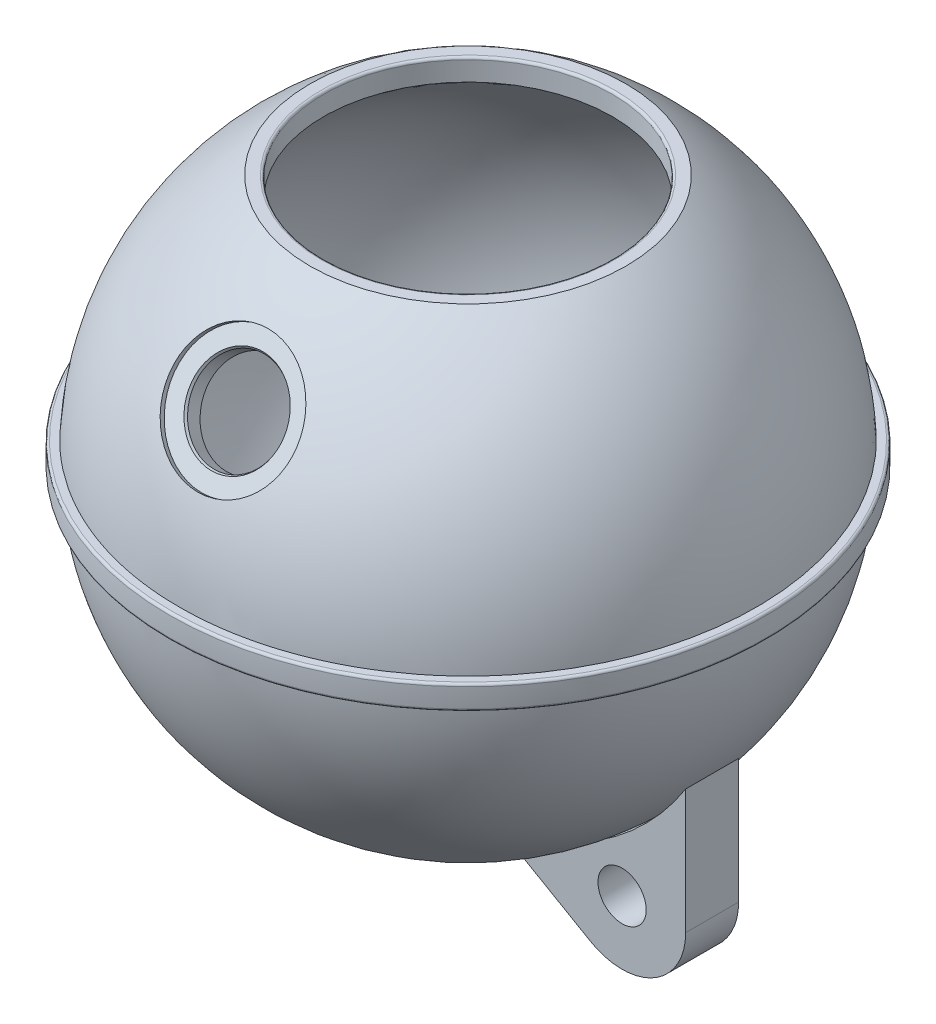
ISO-10303-21;
HEADER;
FILE_DESCRIPTION(('STEP AP214'),'2;1');
FILE_NAME('part.step','',(''),(''),'','','');
FILE_SCHEMA(('AUTOMOTIVE_DESIGN { 1 0 10303 214 1 1 1 1 }'));
ENDSEC;
DATA;
#1=APPLICATION_CONTEXT('core data for automotive mechanical design processes');
#2=APPLICATION_PROTOCOL_DEFINITION('international standard','automotive_design',2000,#1);
#3=PRODUCT_CONTEXT('',#1,'mechanical');
#4=PRODUCT('Part','Part','',(#3));
#5=PRODUCT_RELATED_PRODUCT_CATEGORY('part','',(#4));
#6=PRODUCT_DEFINITION_FORMATION('','',#4);
#7=PRODUCT_DEFINITION_CONTEXT('part definition',#1,'design');
#8=PRODUCT_DEFINITION('design','',#6,#7);
#9=PRODUCT_DEFINITION_SHAPE('','',#8);
#10=(LENGTH_UNIT() NAMED_UNIT(*) SI_UNIT(.MILLI.,.METRE.));
#11=(NAMED_UNIT(*) PLANE_ANGLE_UNIT() SI_UNIT($,.RADIAN.));
#12=(NAMED_UNIT(*) SI_UNIT($,.STERADIAN.) SOLID_ANGLE_UNIT());
#13=UNCERTAINTY_MEASURE_WITH_UNIT(LENGTH_MEASURE(1.E-05),#10,'distance_accuracy_value','');
#14=(GEOMETRIC_REPRESENTATION_CONTEXT(3) GLOBAL_UNCERTAINTY_ASSIGNED_CONTEXT((#13)) GLOBAL_UNIT_ASSIGNED_CONTEXT((#10,
#11,#12)) REPRESENTATION_CONTEXT('',''));
#15=CARTESIAN_POINT('',(0.,0.,0.));
#16=DIRECTION('',(0.,0.,1.));
#17=DIRECTION('',(1.,0.,0.));
#18=AXIS2_PLACEMENT_3D('',#15,#16,#17);
#19=CARTESIAN_POINT('',(95.2500000000001,-147.117317471466,-13.97));
#20=DIRECTION('',(0.,0.,1.));
#21=DIRECTION('',(1.,0.,0.));
#22=AXIS2_PLACEMENT_3D('',#19,#20,#21);
#23=CYLINDRICAL_SURFACE('',#22,33.528);
#24=DIRECTION('',(0.,0.,1.));
#25=VECTOR('',#24,1.);
#26=CARTESIAN_POINT('',(128.778,-147.117317471466,-13.97));
#27=LINE('',#26,#25);
#28=CARTESIAN_POINT('',(128.778,-147.117317471466,-13.97));
#29=VERTEX_POINT('',#28);
#30=CARTESIAN_POINT('',(128.778,-147.117317471466,13.97));
#31=VERTEX_POINT('',#30);
#32=EDGE_CURVE('E63',#29,#31,#27,.T.);
#33=ORIENTED_EDGE('',*,*,#32,.T.);
#34=CARTESIAN_POINT('',(95.2500000000001,-147.117317471466,13.97));
#35=DIRECTION('',(0.,0.,1.));
#36=DIRECTION('',(-1.,0.,0.));
#37=AXIS2_PLACEMENT_3D('',#34,#35,#36);
#38=CIRCLE('',#37,33.528);
#39=CARTESIAN_POINT('',(78.4859999999999,-176.15341720955,13.97));
#40=VERTEX_POINT('',#39);
#41=EDGE_CURVE('E100',#40,#31,#38,.T.);
#42=ORIENTED_EDGE('',*,*,#41,.F.);
#43=DIRECTION('',(0.,0.,1.));
#44=VECTOR('',#43,1.);
#45=CARTESIAN_POINT('',(78.4859999999999,-176.15341720955,-13.97));
#46=LINE('',#45,#44);
#47=CARTESIAN_POINT('',(78.4859999999999,-176.15341720955,-13.97));
#48=VERTEX_POINT('',#47);
#49=EDGE_CURVE('E13',#48,#40,#46,.T.);
#50=ORIENTED_EDGE('',*,*,#49,.F.);
#51=CARTESIAN_POINT('',(95.2500000000001,-147.117317471466,-13.97));
#52=DIRECTION('',(0.,0.,1.));
#53=DIRECTION('',(-1.,0.,0.));
#54=AXIS2_PLACEMENT_3D('',#51,#52,#53);
#55=CIRCLE('',#54,33.528);
#56=EDGE_CURVE('E101',#48,#29,#55,.T.);
#57=ORIENTED_EDGE('',*,*,#56,.T.);
#58=EDGE_LOOP('',(#33,#42,#50,#57));
#59=FACE_BOUND('',#58,.T.);
#60=ADVANCED_FACE('F60',(#59),#23,.T.);
#61=CARTESIAN_POINT('',(78.4859999999999,-176.15341720955,-13.97));
#62=DIRECTION('',(-0.500000000000004,-0.866025403784436,0.));
#63=DIRECTION('',(0.866025403784436,-0.500000000000004,0.));
#64=AXIS2_PLACEMENT_3D('',#61,#62,#63);
#65=PLANE('',#64);
#66=ORIENTED_EDGE('',*,*,#49,.T.);
#67=DIRECTION('',(0.866025403784436,-0.500000000000004,0.));
#68=VECTOR('',#67,1.);
#69=CARTESIAN_POINT('',(78.4859999999999,-176.15341720955,13.97));
#70=LINE('',#69,#68);
#71=CARTESIAN_POINT('',(31.6052209873836,-149.086786826796,13.97));
#72=VERTEX_POINT('',#71);
#73=EDGE_CURVE('E118',#72,#40,#70,.T.);
#74=ORIENTED_EDGE('',*,*,#73,.F.);
#75=DIRECTION('',(0.,0.,1.));
#76=VECTOR('',#75,1.);
#77=CARTESIAN_POINT('',(31.6052209873836,-149.086786826796,-13.97));
#78=LINE('',#77,#76);
#79=CARTESIAN_POINT('',(31.6052209873836,-149.086786826796,-13.97));
#80=VERTEX_POINT('',#79);
#81=EDGE_CURVE('E68',#80,#72,#78,.T.);
#82=ORIENTED_EDGE('',*,*,#81,.F.);
#83=DIRECTION('',(0.866025403784436,-0.500000000000004,0.));
#84=VECTOR('',#83,1.);
#85=CARTESIAN_POINT('',(78.4859999999999,-176.15341720955,-13.97));
#86=LINE('',#85,#84);
#87=EDGE_CURVE('E106',#80,#48,#86,.T.);
#88=ORIENTED_EDGE('',*,*,#87,.T.);
#89=EDGE_LOOP('',(#66,#74,#82,#88));
#90=FACE_BOUND('',#89,.T.);
#91=ADVANCED_FACE('F139',(#90),#65,.T.);
#92=CARTESIAN_POINT('',(0.,0.,-13.97));
#93=DIRECTION('',(0.,0.,1.));
#94=DIRECTION('',(1.,0.,0.));
#95=AXIS2_PLACEMENT_3D('',#92,#93,#94);
#96=CYLINDRICAL_SURFACE('',#95,152.4);
#97=ORIENTED_EDGE('',*,*,#81,.T.);
#98=CARTESIAN_POINT('',(0.,0.,13.97));
#99=DIRECTION('',(0.,0.,-1.));
#100=DIRECTION('',(1.,0.,0.));
#101=AXIS2_PLACEMENT_3D('',#98,#99,#100);
#102=CIRCLE('',#101,152.4);
#103=CARTESIAN_POINT('',(128.778,-81.4983847447298,13.97));
#104=VERTEX_POINT('',#103);
#105=EDGE_CURVE('E113',#104,#72,#102,.T.);
#106=ORIENTED_EDGE('',*,*,#105,.F.);
#107=DIRECTION('',(0.,0.,1.));
#108=VECTOR('',#107,1.);
#109=CARTESIAN_POINT('',(128.778,-81.4983847447298,-13.97));
#110=LINE('',#109,#108);
#111=CARTESIAN_POINT('',(128.778,-81.4983847447298,-13.97));
#112=VERTEX_POINT('',#111);
#113=EDGE_CURVE('E105',#112,#104,#110,.T.);
#114=ORIENTED_EDGE('',*,*,#113,.F.);
#115=CARTESIAN_POINT('',(0.,0.,-13.97));
#116=DIRECTION('',(0.,0.,-1.));
#117=DIRECTION('',(1.,0.,0.));
#118=AXIS2_PLACEMENT_3D('',#115,#116,#117);
#119=CIRCLE('',#118,152.4);
#120=EDGE_CURVE('E132',#112,#80,#119,.T.);
#121=ORIENTED_EDGE('',*,*,#120,.T.);
#122=EDGE_LOOP('',(#97,#106,#114,#121));
#123=FACE_BOUND('',#122,.T.);
#124=ADVANCED_FACE('F136',(#123),#96,.F.);
#125=CARTESIAN_POINT('',(128.778,-81.4983847447298,-13.97));
#126=DIRECTION('',(1.,0.,0.));
#127=DIRECTION('',(0.,0.,-1.));
#128=AXIS2_PLACEMENT_3D('',#125,#126,#127);
#129=PLANE('',#128);
#130=ORIENTED_EDGE('',*,*,#113,.T.);
#131=DIRECTION('',(0.,1.,0.));
#132=VECTOR('',#131,1.);
#133=CARTESIAN_POINT('',(128.778,-81.4983847447298,13.97));
#134=LINE('',#133,#132);
#135=EDGE_CURVE('E108',#31,#104,#134,.T.);
#136=ORIENTED_EDGE('',*,*,#135,.F.);
#137=ORIENTED_EDGE('',*,*,#32,.F.);
#138=DIRECTION('',(0.,1.,0.));
#139=VECTOR('',#138,1.);
#140=CARTESIAN_POINT('',(128.778,-81.4983847447298,-13.97));
#141=LINE('',#140,#139);
#142=EDGE_CURVE('E130',#29,#112,#141,.T.);
#143=ORIENTED_EDGE('',*,*,#142,.T.);
#144=EDGE_LOOP('',(#130,#136,#137,#143));
#145=FACE_BOUND('',#144,.T.);
#146=ADVANCED_FACE('F109',(#145),#129,.T.);
#147=CARTESIAN_POINT('',(95.2500000000001,-147.117317471466,-13.97));
#148=DIRECTION('',(0.,0.,-1.));
#149=DIRECTION('',(-1.,0.,0.));
#150=AXIS2_PLACEMENT_3D('',#147,#148,#149);
#151=PLANE('',#150);
#152=CARTESIAN_POINT('',(95.2500000000001,-147.117317471466,-13.97));
#153=DIRECTION('',(0.,0.,1.));
#154=DIRECTION('',(-1.,0.,0.));
#155=AXIS2_PLACEMENT_3D('',#152,#153,#154);
#156=CIRCLE('',#155,12.7);
#157=CARTESIAN_POINT('',(82.5500000000001,-147.117317471466,-13.97));
#158=VERTEX_POINT('',#157);
#159=EDGE_CURVE('E126',#158,#158,#156,.T.);
#160=ORIENTED_EDGE('',*,*,#159,.T.);
#161=EDGE_LOOP('',(#160));
#162=FACE_BOUND('',#161,.T.);
#163=ORIENTED_EDGE('',*,*,#56,.F.);
#164=ORIENTED_EDGE('',*,*,#87,.F.);
#165=ORIENTED_EDGE('',*,*,#120,.F.);
#166=ORIENTED_EDGE('',*,*,#142,.F.);
#167=EDGE_LOOP('',(#163,#164,#165,#166));
#168=FACE_BOUND('',#167,.T.);
#169=ADVANCED_FACE('F141',(#162,#168),#151,.T.);
#170=CARTESIAN_POINT('',(95.2500000000001,-147.117317471466,-13.97));
#171=DIRECTION('',(0.,0.,1.));
#172=DIRECTION('',(1.,0.,0.));
#173=AXIS2_PLACEMENT_3D('',#170,#171,#172);
#174=CYLINDRICAL_SURFACE('',#173,12.7);
#175=ORIENTED_EDGE('',*,*,#159,.F.);
#176=EDGE_LOOP('',(#175));
#177=FACE_BOUND('',#176,.T.);
#178=CARTESIAN_POINT('',(95.2500000000001,-147.117317471466,13.97));
#179=DIRECTION('',(0.,0.,1.));
#180=DIRECTION('',(-1.,0.,0.));
#181=AXIS2_PLACEMENT_3D('',#178,#179,#180);
#182=CIRCLE('',#181,12.7);
#183=CARTESIAN_POINT('',(82.5500000000001,-147.117317471466,13.97));
#184=VERTEX_POINT('',#183);
#185=EDGE_CURVE('E119',#184,#184,#182,.T.);
#186=ORIENTED_EDGE('',*,*,#185,.T.);
#187=EDGE_LOOP('',(#186));
#188=FACE_BOUND('',#187,.T.);
#189=ADVANCED_FACE('F143',(#177,#188),#174,.F.);
#190=CARTESIAN_POINT('',(95.2500000000001,-147.117317471466,13.97));
#191=DIRECTION('',(0.,0.,-1.));
#192=DIRECTION('',(-1.,0.,0.));
#193=AXIS2_PLACEMENT_3D('',#190,#191,#192);
#194=PLANE('',#193);
#195=ORIENTED_EDGE('',*,*,#41,.T.);
#196=ORIENTED_EDGE('',*,*,#135,.T.);
#197=ORIENTED_EDGE('',*,*,#105,.T.);
#198=ORIENTED_EDGE('',*,*,#73,.T.);
#199=EDGE_LOOP('',(#195,#196,#197,#198));
#200=FACE_BOUND('',#199,.T.);
#201=ORIENTED_EDGE('',*,*,#185,.F.);
#202=EDGE_LOOP('',(#201));
#203=FACE_BOUND('',#202,.T.);
#204=ADVANCED_FACE('F116',(#200,#203),#194,.F.);
#205=CLOSED_SHELL('',(#60,#91,#124,#146,#169,#189,#204));
#206=MANIFOLD_SOLID_BREP('B2',#205);
#207=CARTESIAN_POINT('',(0.,0.,-13.97));
#208=DIRECTION('',(0.,0.,1.));
#209=DIRECTION('',(1.,0.,0.));
#210=AXIS2_PLACEMENT_3D('',#207,#208,#209);
#211=CYLINDRICAL_SURFACE('',#210,152.4);
#212=DIRECTION('',(0.,0.,1.));
#213=VECTOR('',#212,1.);
#214=CARTESIAN_POINT('',(-128.778,-81.4983847447298,-13.97));
#215=LINE('',#214,#213);
#216=CARTESIAN_POINT('',(-128.778,-81.4983847447298,-13.97));
#217=VERTEX_POINT('',#216);
#218=CARTESIAN_POINT('',(-128.778,-81.4983847447298,13.97));
#219=VERTEX_POINT('',#218);
#220=EDGE_CURVE('E215',#217,#219,#215,.T.);
#221=ORIENTED_EDGE('',*,*,#220,.T.);
#222=CARTESIAN_POINT('',(0.,0.,13.97));
#223=DIRECTION('',(0.,0.,-1.));
#224=DIRECTION('',(-1.,0.,0.));
#225=AXIS2_PLACEMENT_3D('',#222,#223,#224);
#226=CIRCLE('',#225,152.4);
#227=CARTESIAN_POINT('',(-31.6052209873834,-149.086786826797,13.97));
#228=VERTEX_POINT('',#227);
#229=EDGE_CURVE('E252',#228,#219,#226,.T.);
#230=ORIENTED_EDGE('',*,*,#229,.F.);
#231=DIRECTION('',(0.,0.,1.));
#232=VECTOR('',#231,1.);
#233=CARTESIAN_POINT('',(-31.6052209873834,-149.086786826797,-13.97));
#234=LINE('',#233,#232);
#235=CARTESIAN_POINT('',(-31.6052209873834,-149.086786826797,-13.97));
#236=VERTEX_POINT('',#235);
#237=EDGE_CURVE('E58',#236,#228,#234,.T.);
#238=ORIENTED_EDGE('',*,*,#237,.F.);
#239=CARTESIAN_POINT('',(0.,0.,-13.97));
#240=DIRECTION('',(0.,0.,-1.));
#241=DIRECTION('',(-1.,0.,0.));
#242=AXIS2_PLACEMENT_3D('',#239,#240,#241);
#243=CIRCLE('',#242,152.4);
#244=EDGE_CURVE('E253',#236,#217,#243,.T.);
#245=ORIENTED_EDGE('',*,*,#244,.T.);
#246=EDGE_LOOP('',(#221,#230,#238,#245));
#247=FACE_BOUND('',#246,.T.);
#248=ADVANCED_FACE('F212',(#247),#211,.F.);
#249=CARTESIAN_POINT('',(-78.4859999999998,-176.15341720955,-13.97));
#250=DIRECTION('',(0.500000000000003,-0.866025403784437,0.));
#251=DIRECTION('',(0.866025403784437,0.500000000000003,0.));
#252=AXIS2_PLACEMENT_3D('',#249,#250,#251);
#253=PLANE('',#252);
#254=ORIENTED_EDGE('',*,*,#237,.T.);
#255=DIRECTION('',(0.866025403784437,0.500000000000003,0.));
#256=VECTOR('',#255,1.);
#257=CARTESIAN_POINT('',(-78.4859999999998,-176.15341720955,13.97));
#258=LINE('',#257,#256);
#259=CARTESIAN_POINT('',(-78.4859999999998,-176.15341720955,13.97));
#260=VERTEX_POINT('',#259);
#261=EDGE_CURVE('E270',#260,#228,#258,.T.);
#262=ORIENTED_EDGE('',*,*,#261,.F.);
#263=DIRECTION('',(0.,0.,1.));
#264=VECTOR('',#263,1.);
#265=CARTESIAN_POINT('',(-78.4859999999998,-176.15341720955,-13.97));
#266=LINE('',#265,#264);
#267=CARTESIAN_POINT('',(-78.4859999999998,-176.15341720955,-13.97));
#268=VERTEX_POINT('',#267);
#269=EDGE_CURVE('E220',#268,#260,#266,.T.);
#270=ORIENTED_EDGE('',*,*,#269,.F.);
#271=DIRECTION('',(0.866025403784437,0.500000000000003,0.));
#272=VECTOR('',#271,1.);
#273=CARTESIAN_POINT('',(-78.4859999999998,-176.15341720955,-13.97));
#274=LINE('',#273,#272);
#275=EDGE_CURVE('E258',#268,#236,#274,.T.);
#276=ORIENTED_EDGE('',*,*,#275,.T.);
#277=EDGE_LOOP('',(#254,#262,#270,#276));
#278=FACE_BOUND('',#277,.T.);
#279=ADVANCED_FACE('F291',(#278),#253,.T.);
#280=CARTESIAN_POINT('',(-95.25,-147.117317471466,-13.97));
#281=DIRECTION('',(0.,0.,1.));
#282=DIRECTION('',(1.,0.,0.));
#283=AXIS2_PLACEMENT_3D('',#280,#281,#282);
#284=CYLINDRICAL_SURFACE('',#283,33.528);
#285=ORIENTED_EDGE('',*,*,#269,.T.);
#286=CARTESIAN_POINT('',(-95.25,-147.117317471466,13.97));
#287=DIRECTION('',(0.,0.,1.));
#288=DIRECTION('',(1.,0.,0.));
#289=AXIS2_PLACEMENT_3D('',#286,#287,#288);
#290=CIRCLE('',#289,33.528);
#291=CARTESIAN_POINT('',(-128.778,-147.117317471466,13.97));
#292=VERTEX_POINT('',#291);
#293=EDGE_CURVE('E265',#292,#260,#290,.T.);
#294=ORIENTED_EDGE('',*,*,#293,.F.);
#295=DIRECTION('',(0.,0.,1.));
#296=VECTOR('',#295,1.);
#297=CARTESIAN_POINT('',(-128.778,-147.117317471466,-13.97));
#298=LINE('',#297,#296);
#299=CARTESIAN_POINT('',(-128.778,-147.117317471466,-13.97));
#300=VERTEX_POINT('',#299);
#301=EDGE_CURVE('E257',#300,#292,#298,.T.);
#302=ORIENTED_EDGE('',*,*,#301,.F.);
#303=CARTESIAN_POINT('',(-95.25,-147.117317471466,-13.97));
#304=DIRECTION('',(0.,0.,1.));
#305=DIRECTION('',(1.,0.,0.));
#306=AXIS2_PLACEMENT_3D('',#303,#304,#305);
#307=CIRCLE('',#306,33.528);
#308=EDGE_CURVE('E284',#300,#268,#307,.T.);
#309=ORIENTED_EDGE('',*,*,#308,.T.);
#310=EDGE_LOOP('',(#285,#294,#302,#309));
#311=FACE_BOUND('',#310,.T.);
#312=ADVANCED_FACE('F288',(#311),#284,.T.);
#313=CARTESIAN_POINT('',(-128.778,-81.4983847447298,-13.97));
#314=DIRECTION('',(-1.,0.,0.));
#315=DIRECTION('',(0.,0.,1.));
#316=AXIS2_PLACEMENT_3D('',#313,#314,#315);
#317=PLANE('',#316);
#318=ORIENTED_EDGE('',*,*,#301,.T.);
#319=DIRECTION('',(0.,-1.,0.));
#320=VECTOR('',#319,1.);
#321=CARTESIAN_POINT('',(-128.778,-81.4983847447298,13.97));
#322=LINE('',#321,#320);
#323=EDGE_CURVE('E260',#219,#292,#322,.T.);
#324=ORIENTED_EDGE('',*,*,#323,.F.);
#325=ORIENTED_EDGE('',*,*,#220,.F.);
#326=DIRECTION('',(0.,-1.,0.));
#327=VECTOR('',#326,1.);
#328=CARTESIAN_POINT('',(-128.778,-81.4983847447298,-13.97));
#329=LINE('',#328,#327);
#330=EDGE_CURVE('E282',#217,#300,#329,.T.);
#331=ORIENTED_EDGE('',*,*,#330,.T.);
#332=EDGE_LOOP('',(#318,#324,#325,#331));
#333=FACE_BOUND('',#332,.T.);
#334=ADVANCED_FACE('F261',(#333),#317,.T.);
#335=CARTESIAN_POINT('',(0.,0.,-13.97));
#336=DIRECTION('',(0.,0.,-1.));
#337=DIRECTION('',(-1.,0.,0.));
#338=AXIS2_PLACEMENT_3D('',#335,#336,#337);
#339=PLANE('',#338);
#340=CARTESIAN_POINT('',(-95.25,-147.117317471466,-13.97));
#341=DIRECTION('',(0.,0.,1.));
#342=DIRECTION('',(1.,0.,0.));
#343=AXIS2_PLACEMENT_3D('',#340,#341,#342);
#344=CIRCLE('',#343,12.7);
#345=CARTESIAN_POINT('',(-82.55,-147.117317471466,-13.97));
#346=VERTEX_POINT('',#345);
#347=EDGE_CURVE('E278',#346,#346,#344,.T.);
#348=ORIENTED_EDGE('',*,*,#347,.T.);
#349=EDGE_LOOP('',(#348));
#350=FACE_BOUND('',#349,.T.);
#351=ORIENTED_EDGE('',*,*,#244,.F.);
#352=ORIENTED_EDGE('',*,*,#275,.F.);
#353=ORIENTED_EDGE('',*,*,#308,.F.);
#354=ORIENTED_EDGE('',*,*,#330,.F.);
#355=EDGE_LOOP('',(#351,#352,#353,#354));
#356=FACE_BOUND('',#355,.T.);
#357=ADVANCED_FACE('F293',(#350,#356),#339,.T.);
#358=CARTESIAN_POINT('',(-95.25,-147.117317471466,-13.97));
#359=DIRECTION('',(0.,0.,1.));
#360=DIRECTION('',(1.,0.,0.));
#361=AXIS2_PLACEMENT_3D('',#358,#359,#360);
#362=CYLINDRICAL_SURFACE('',#361,12.7);
#363=ORIENTED_EDGE('',*,*,#347,.F.);
#364=EDGE_LOOP('',(#363));
#365=FACE_BOUND('',#364,.T.);
#366=CARTESIAN_POINT('',(-95.25,-147.117317471466,13.97));
#367=DIRECTION('',(0.,0.,1.));
#368=DIRECTION('',(1.,0.,0.));
#369=AXIS2_PLACEMENT_3D('',#366,#367,#368);
#370=CIRCLE('',#369,12.7);
#371=CARTESIAN_POINT('',(-82.55,-147.117317471466,13.97));
#372=VERTEX_POINT('',#371);
#373=EDGE_CURVE('E271',#372,#372,#370,.T.);
#374=ORIENTED_EDGE('',*,*,#373,.T.);
#375=EDGE_LOOP('',(#374));
#376=FACE_BOUND('',#375,.T.);
#377=ADVANCED_FACE('F295',(#365,#376),#362,.F.);
#378=CARTESIAN_POINT('',(0.,0.,13.97));
#379=DIRECTION('',(0.,0.,-1.));
#380=DIRECTION('',(-1.,0.,0.));
#381=AXIS2_PLACEMENT_3D('',#378,#379,#380);
#382=PLANE('',#381);
#383=ORIENTED_EDGE('',*,*,#229,.T.);
#384=ORIENTED_EDGE('',*,*,#323,.T.);
#385=ORIENTED_EDGE('',*,*,#293,.T.);
#386=ORIENTED_EDGE('',*,*,#261,.T.);
#387=EDGE_LOOP('',(#383,#384,#385,#386));
#388=FACE_BOUND('',#387,.T.);
#389=ORIENTED_EDGE('',*,*,#373,.F.);
#390=EDGE_LOOP('',(#389));
#391=FACE_BOUND('',#390,.T.);
#392=ADVANCED_FACE('F268',(#388,#391),#382,.F.);
#393=CLOSED_SHELL('',(#248,#279,#312,#334,#357,#377,#392));
#394=MANIFOLD_SOLID_BREP('B7',#393);
#395=CARTESIAN_POINT('',(0.,-127.512101407476,-192.649770418207));
#396=DIRECTION('',(0.,0.551936985312059,0.833885822067168));
#397=DIRECTION('',(0.,-0.833885822067168,0.551936985312059));
#398=AXIS2_PLACEMENT_3D('',#395,#396,#397);
#399=CYLINDRICAL_SURFACE('',#398,23.8125);
#400=CARTESIAN_POINT('',(0.,79.9094367334799,120.729989318885));
#401=DIRECTION('',(0.,0.55193698531207,0.83388582206716));
#402=DIRECTION('',(0.,-0.83388582206716,0.55193698531207));
#403=AXIS2_PLACEMENT_3D('',#400,#401,#402);
#404=CIRCLE('',#403,23.8125);
#405=CARTESIAN_POINT('',(0.,60.0525305955056,133.872988781628));
#406=VERTEX_POINT('',#405);
#407=EDGE_CURVE('E368',#406,#406,#404,.T.);
#408=ORIENTED_EDGE('',*,*,#407,.T.);
#409=EDGE_LOOP('',(#408));
#410=FACE_BOUND('',#409,.T.);
#411=CARTESIAN_POINT('',(0.,75.5503407684691,114.144113722602));
#412=DIRECTION('',(0.,-0.551936985312059,-0.833885822067168));
#413=DIRECTION('',(0.,0.833885822067168,-0.551936985312059));
#414=AXIS2_PLACEMENT_3D('',#411,#412,#413);
#415=CIRCLE('',#414,23.8125);
#416=CARTESIAN_POINT('',(0.,95.4072469064435,101.001114259858));
#417=VERTEX_POINT('',#416);
#418=EDGE_CURVE('E387',#417,#417,#415,.F.);
#419=ORIENTED_EDGE('',*,*,#418,.F.);
#420=EDGE_LOOP('',(#419));
#421=FACE_BOUND('',#420,.T.);
#422=ADVANCED_FACE('F357',(#410,#421),#399,.F.);
#423=CARTESIAN_POINT('',(0.,127.608000688599,0.));
#424=DIRECTION('',(0.,-1.,0.));
#425=DIRECTION('',(0.,0.,-1.));
#426=AXIS2_PLACEMENT_3D('',#423,#424,#425);
#427=CYLINDRICAL_SURFACE('',#426,15.0749);
#428=CARTESIAN_POINT('',(0.,-146.05,0.));
#429=DIRECTION('',(0.,-1.,0.));
#430=DIRECTION('',(0.,0.,-1.));
#431=AXIS2_PLACEMENT_3D('',#428,#429,#430);
#432=CIRCLE('',#431,15.0749);
#433=CARTESIAN_POINT('',(0.,-146.05,-15.0749));
#434=VERTEX_POINT('',#433);
#435=EDGE_CURVE('E383',#434,#434,#432,.T.);
#436=ORIENTED_EDGE('',*,*,#435,.T.);
#437=EDGE_LOOP('',(#436));
#438=FACE_BOUND('',#437,.T.);
#439=CARTESIAN_POINT('',(0.,-138.117758575753,0.));
#440=DIRECTION('',(0.,1.,0.));
#441=DIRECTION('',(0.,0.,1.));
#442=AXIS2_PLACEMENT_3D('',#439,#440,#441);
#443=CIRCLE('',#442,15.0749);
#444=CARTESIAN_POINT('',(0.,-138.117758575753,15.0749));
#445=VERTEX_POINT('',#444);
#446=EDGE_CURVE('E397',#445,#445,#443,.T.);
#447=ORIENTED_EDGE('',*,*,#446,.T.);
#448=EDGE_LOOP('',(#447));
#449=FACE_BOUND('',#448,.T.);
#450=ADVANCED_FACE('F479',(#438,#449),#427,.F.);
#451=CARTESIAN_POINT('',(0.,0.,0.));
#452=DIRECTION('',(0.,0.,1.));
#453=DIRECTION('',(-1.,0.,0.));
#454=AXIS2_PLACEMENT_3D('',#451,#452,#453);
#455=SPHERICAL_SURFACE('',#454,152.4);
#456=CARTESIAN_POINT('',(0.,82.0385235703655,123.946688642313));
#457=DIRECTION('',(0.,-0.551936985312059,-0.833885822067168));
#458=DIRECTION('',(0.,0.833885822067168,-0.551936985312059));
#459=AXIS2_PLACEMENT_3D('',#456,#457,#458);
#460=CIRCLE('',#459,33.655);
#461=CARTESIAN_POINT('',(0.,110.102950912036,105.371249401636));
#462=VERTEX_POINT('',#461);
#463=EDGE_CURVE('E384',#462,#462,#460,.T.);
#464=ORIENTED_EDGE('',*,*,#463,.T.);
#465=EDGE_LOOP('',(#464));
#466=FACE_BOUND('',#465,.T.);
#467=CARTESIAN_POINT('',(0.,127.608000688599,0.));
#468=DIRECTION('',(0.,1.,0.));
#469=DIRECTION('',(0.,0.,1.));
#470=AXIS2_PLACEMENT_3D('',#467,#468,#469);
#471=CIRCLE('',#470,83.3184142927518);
#472=CARTESIAN_POINT('',(0.,127.608000688599,83.3184142927518));
#473=VERTEX_POINT('',#472);
#474=EDGE_CURVE('E419',#473,#473,#471,.T.);
#475=ORIENTED_EDGE('',*,*,#474,.F.);
#476=EDGE_LOOP('',(#475));
#477=FACE_BOUND('',#476,.T.);
#478=CARTESIAN_POINT('',(0.,6.35000000000028,0.));
#479=DIRECTION('',(0.,-1.,0.));
#480=DIRECTION('',(0.,0.,-1.));
#481=AXIS2_PLACEMENT_3D('',#478,#479,#480);
#482=CIRCLE('',#481,152.267650865179);
#483=CARTESIAN_POINT('',(0.,6.35000000000028,-152.267650865179));
#484=VERTEX_POINT('',#483);
#485=EDGE_CURVE('E410',#484,#484,#482,.T.);
#486=ORIENTED_EDGE('',*,*,#485,.F.);
#487=EDGE_LOOP('',(#486));
#488=FACE_BOUND('',#487,.T.);
#489=ADVANCED_FACE('F462',(#466,#477,#488),#455,.T.);
#490=CARTESIAN_POINT('',(0.,152.4,0.));
#491=DIRECTION('',(0.,-1.,0.));
#492=DIRECTION('',(0.,0.,-1.));
#493=AXIS2_PLACEMENT_3D('',#490,#491,#492);
#494=CYLINDRICAL_SURFACE('',#493,76.2);
#495=CARTESIAN_POINT('',(0.,126.338000688599,0.));
#496=DIRECTION('',(0.,1.,0.));
#497=DIRECTION('',(0.,0.,1.));
#498=AXIS2_PLACEMENT_3D('',#495,#496,#497);
#499=CIRCLE('',#498,76.2);
#500=CARTESIAN_POINT('',(0.,126.338000688599,-76.2));
#501=VERTEX_POINT('',#500);
#502=EDGE_CURVE('E364',#501,#501,#499,.T.);
#503=CARTESIAN_POINT('',(0.,116.178000688599,0.));
#504=DIRECTION('',(0.,-1.,0.));
#505=DIRECTION('',(0.,0.,-1.));
#506=AXIS2_PLACEMENT_3D('',#503,#504,#505);
#507=CIRCLE('',#506,76.2);
#508=CARTESIAN_POINT('',(0.,116.178000688599,-76.2));
#509=VERTEX_POINT('',#508);
#510=EDGE_CURVE('E416',#509,#509,#507,.F.);
#511=CARTESIAN_POINT('',(0.,126.338000688599,-76.2));
#512=CARTESIAN_POINT('',(0.,126.232167355265,-76.2));
#513=CARTESIAN_POINT('',(0.,126.126334021932,-76.2));
#514=CARTESIAN_POINT('',(0.,125.914667355265,-76.2));
#515=CARTESIAN_POINT('',(0.,125.808834021932,-76.2));
#516=CARTESIAN_POINT('',(0.,125.597167355265,-76.2));
#517=CARTESIAN_POINT('',(0.,125.491334021932,-76.2));
#518=CARTESIAN_POINT('',(0.,125.279667355265,-76.2));
#519=CARTESIAN_POINT('',(0.,125.173834021932,-76.2));
#520=CARTESIAN_POINT('',(0.,124.962167355265,-76.2));
#521=CARTESIAN_POINT('',(0.,124.856334021932,-76.2));
#522=CARTESIAN_POINT('',(0.,124.644667355265,-76.2));
#523=CARTESIAN_POINT('',(0.,124.538834021932,-76.2));
#524=CARTESIAN_POINT('',(0.,124.327167355265,-76.2));
#525=CARTESIAN_POINT('',(0.,124.221334021932,-76.2));
#526=CARTESIAN_POINT('',(0.,124.009667355265,-76.2));
#527=CARTESIAN_POINT('',(0.,123.903834021932,-76.2));
#528=CARTESIAN_POINT('',(0.,123.692167355265,-76.2));
#529=CARTESIAN_POINT('',(0.,123.586334021932,-76.2));
#530=CARTESIAN_POINT('',(0.,123.374667355265,-76.2));
#531=CARTESIAN_POINT('',(0.,123.268834021932,-76.2));
#532=CARTESIAN_POINT('',(0.,123.057167355265,-76.2));
#533=CARTESIAN_POINT('',(0.,122.951334021932,-76.2));
#534=CARTESIAN_POINT('',(0.,122.739667355265,-76.2));
#535=CARTESIAN_POINT('',(0.,122.633834021932,-76.2));
#536=CARTESIAN_POINT('',(0.,122.422167355265,-76.2));
#537=CARTESIAN_POINT('',(0.,122.316334021932,-76.2));
#538=CARTESIAN_POINT('',(0.,122.104667355265,-76.2));
#539=CARTESIAN_POINT('',(0.,121.998834021932,-76.2));
#540=CARTESIAN_POINT('',(0.,121.787167355265,-76.2));
#541=CARTESIAN_POINT('',(0.,121.681334021932,-76.2));
#542=CARTESIAN_POINT('',(0.,121.469667355265,-76.2));
#543=CARTESIAN_POINT('',(0.,121.363834021932,-76.2));
#544=CARTESIAN_POINT('',(0.,121.152167355265,-76.2));
#545=CARTESIAN_POINT('',(0.,121.046334021932,-76.2));
#546=CARTESIAN_POINT('',(0.,120.834667355265,-76.2));
#547=CARTESIAN_POINT('',(0.,120.728834021932,-76.2));
#548=CARTESIAN_POINT('',(0.,120.517167355265,-76.2));
#549=CARTESIAN_POINT('',(0.,120.411334021932,-76.2));
#550=CARTESIAN_POINT('',(0.,120.199667355265,-76.2));
#551=CARTESIAN_POINT('',(0.,120.093834021932,-76.2));
#552=CARTESIAN_POINT('',(0.,119.882167355265,-76.2));
#553=CARTESIAN_POINT('',(0.,119.776334021932,-76.2));
#554=CARTESIAN_POINT('',(0.,119.564667355265,-76.2));
#555=CARTESIAN_POINT('',(0.,119.458834021932,-76.2));
#556=CARTESIAN_POINT('',(0.,119.247167355265,-76.2));
#557=CARTESIAN_POINT('',(0.,119.141334021932,-76.2));
#558=CARTESIAN_POINT('',(0.,118.929667355265,-76.2));
#559=CARTESIAN_POINT('',(0.,118.823834021932,-76.2));
#560=CARTESIAN_POINT('',(0.,118.612167355265,-76.2));
#561=CARTESIAN_POINT('',(0.,118.506334021932,-76.2));
#562=CARTESIAN_POINT('',(0.,118.294667355265,-76.2));
#563=CARTESIAN_POINT('',(0.,118.188834021932,-76.2));
#564=CARTESIAN_POINT('',(0.,117.977167355265,-76.2));
#565=CARTESIAN_POINT('',(0.,117.871334021932,-76.2));
#566=CARTESIAN_POINT('',(0.,117.659667355265,-76.2));
#567=CARTESIAN_POINT('',(0.,117.553834021932,-76.2));
#568=CARTESIAN_POINT('',(0.,117.342167355265,-76.2));
#569=CARTESIAN_POINT('',(0.,117.236334021932,-76.2));
#570=CARTESIAN_POINT('',(0.,117.024667355265,-76.2));
#571=CARTESIAN_POINT('',(0.,116.918834021932,-76.2));
#572=CARTESIAN_POINT('',(0.,116.707167355265,-76.2));
#573=CARTESIAN_POINT('',(0.,116.601334021932,-76.2));
#574=CARTESIAN_POINT('',(0.,116.389667355265,-76.2));
#575=CARTESIAN_POINT('',(0.,116.283834021932,-76.2));
#576=CARTESIAN_POINT('',(0.,116.178000688599,-76.2));
#577=B_SPLINE_CURVE_WITH_KNOTS('',3,(#511,#512,#513,#514,#515,#516,#517,#518,#519,#520,#521,
#522,#523,#524,#525,#526,#527,#528,#529,#530,#531,#532,#533,#534,#535,#536,#537,#538,#539,#540,
#541,#542,#543,#544,#545,#546,#547,#548,#549,#550,#551,#552,#553,#554,#555,#556,#557,#558,#559,
#560,#561,#562,#563,#564,#565,#566,#567,#568,#569,#570,#571,#572,#573,#574,#575,#576),
.UNSPECIFIED.,.F.,.F.,(4,2,2,2,2,2,2,2,2,2,2,2,2,2,2,2,2,2,2,2,2,2,2,2,2,2,2,2,2,2,2,2,4),(0.,
0.317499999999998,0.635000000000024,0.952500000000023,1.27000000000002,1.58750000000002,
1.90500000000002,2.22250000000002,2.54000000000001,2.85750000000001,3.17500000000001,
3.49250000000001,3.81000000000002,4.12750000000002,4.44500000000002,4.76250000000002,
5.08000000000002,5.39750000000001,5.71500000000003,6.03250000000002,6.35000000000002,
6.66750000000002,6.98500000000002,7.30250000000002,7.62000000000002,7.93750000000001,
8.25500000000001,8.57250000000001,8.89000000000002,9.20750000000002,9.52500000000003,
9.84250000000003,10.16),.UNSPECIFIED.);
#578=EDGE_CURVE('BSEAM538',#501,#509,#577,.T.);
#579=ORIENTED_EDGE('',*,*,#502,.T.);
#580=ORIENTED_EDGE('',*,*,#510,.F.);
#581=ORIENTED_EDGE('',*,*,#578,.T.);
#582=ORIENTED_EDGE('',*,*,#578,.F.);
#583=EDGE_LOOP('',(#579,#581,#580,#582));
#584=FACE_BOUND('',#583,.T.);
#585=ADVANCED_FACE('F538',(#584),#494,.F.);
#586=CARTESIAN_POINT('',(0.,0.,0.));
#587=DIRECTION('',(0.,0.,1.));
#588=DIRECTION('',(-1.,0.,0.));
#589=AXIS2_PLACEMENT_3D('',#586,#587,#588);
#590=SPHERICAL_SURFACE('',#589,138.938);
#591=CARTESIAN_POINT('',(0.,-115.796377835704,76.6439505282119));
#592=DIRECTION('',(0.,0.83388582206717,-0.551936985312056));
#593=DIRECTION('',(0.,0.551936985312056,0.83388582206717));
#594=AXIS2_PLACEMENT_3D('',#591,#592,#593);
#595=CIRCLE('',#594,4.5466);
#596=CARTESIAN_POINT('',(0.,-113.286941138284,80.4352958068225));
#597=VERTEX_POINT('',#596);
#598=EDGE_CURVE('E433',#597,#597,#595,.T.);
#599=ORIENTED_EDGE('',*,*,#598,.F.);
#600=EDGE_LOOP('',(#599));
#601=FACE_BOUND('',#600,.T.);
#602=ORIENTED_EDGE('',*,*,#418,.T.);
#603=EDGE_LOOP('',(#602));
#604=FACE_BOUND('',#603,.T.);
#605=ORIENTED_EDGE('',*,*,#446,.F.);
#606=EDGE_LOOP('',(#605));
#607=FACE_BOUND('',#606,.T.);
#608=ORIENTED_EDGE('',*,*,#510,.T.);
#609=EDGE_LOOP('',(#608));
#610=FACE_BOUND('',#609,.T.);
#611=ADVANCED_FACE('F550',(#601,#604,#607,#610),#590,.F.);
#612=CARTESIAN_POINT('',(0.,127.608000688599,0.));
#613=DIRECTION('',(0.,1.,0.));
#614=DIRECTION('',(0.,0.,1.));
#615=AXIS2_PLACEMENT_3D('',#612,#613,#614);
#616=PLANE('',#615);
#617=CARTESIAN_POINT('',(0.,127.608000688599,0.));
#618=DIRECTION('',(0.,1.,0.));
#619=DIRECTION('',(0.,0.,1.));
#620=AXIS2_PLACEMENT_3D('',#617,#618,#619);
#621=CIRCLE('',#620,77.47);
#622=CARTESIAN_POINT('',(0.,127.608000688599,77.47));
#623=VERTEX_POINT('',#622);
#624=EDGE_CURVE('E211',#623,#623,#621,.F.);
#625=ORIENTED_EDGE('',*,*,#624,.T.);
#626=EDGE_LOOP('',(#625));
#627=FACE_BOUND('',#626,.T.);
#628=ORIENTED_EDGE('',*,*,#474,.T.);
#629=EDGE_LOOP('',(#628));
#630=FACE_BOUND('',#629,.T.);
#631=ADVANCED_FACE('F544',(#627,#630),#616,.T.);
#632=CARTESIAN_POINT('',(-157.347650865179,6.35000000000028,0.));
#633=DIRECTION('',(0.,-1.,0.));
#634=DIRECTION('',(0.,0.,-1.));
#635=AXIS2_PLACEMENT_3D('',#632,#633,#634);
#636=PLANE('',#635);
#637=CARTESIAN_POINT('',(0.,6.35000000000028,0.));
#638=DIRECTION('',(0.,-1.,0.));
#639=DIRECTION('',(0.,0.,-1.));
#640=AXIS2_PLACEMENT_3D('',#637,#638,#639);
#641=CIRCLE('',#640,156.124597718687);
#642=CARTESIAN_POINT('',(0.,6.35000000000028,-156.124597718687));
#643=VERTEX_POINT('',#642);
#644=EDGE_CURVE('E393',#643,#643,#641,.F.);
#645=ORIENTED_EDGE('',*,*,#644,.T.);
#646=EDGE_LOOP('',(#645));
#647=FACE_BOUND('',#646,.T.);
#648=ORIENTED_EDGE('',*,*,#485,.T.);
#649=EDGE_LOOP('',(#648));
#650=FACE_BOUND('',#649,.T.);
#651=ADVANCED_FACE('F474',(#647,#650),#636,.F.);
#652=CARTESIAN_POINT('',(0.,5.62017297276346E-13,0.));
#653=DIRECTION('',(0.,-1.,0.));
#654=DIRECTION('',(0.,0.,-1.));
#655=AXIS2_PLACEMENT_3D('',#652,#653,#654);
#656=DEGENERATE_TOROIDAL_SURFACE('',#655,5.08000000000001,152.4,.T.);
#657=CARTESIAN_POINT('',(0.,-5.12268907563055,0.));
#658=DIRECTION('',(0.,1.,0.));
#659=DIRECTION('',(0.,0.,1.));
#660=AXIS2_PLACEMENT_3D('',#657,#658,#659);
#661=CIRCLE('',#660,157.393880052457);
#662=CARTESIAN_POINT('',(0.,-5.12268907563055,157.393880052457));
#663=VERTEX_POINT('',#662);
#664=EDGE_CURVE('E401',#663,#663,#661,.T.);
#665=ORIENTED_EDGE('',*,*,#664,.T.);
#666=EDGE_LOOP('',(#665));
#667=FACE_BOUND('',#666,.T.);
#668=CARTESIAN_POINT('',(0.,5.12268907563053,0.));
#669=DIRECTION('',(0.,-1.,0.));
#670=DIRECTION('',(0.,0.,-1.));
#671=AXIS2_PLACEMENT_3D('',#668,#669,#670);
#672=CIRCLE('',#671,157.393880052458);
#673=CARTESIAN_POINT('',(0.,5.12268907563053,-157.393880052458));
#674=VERTEX_POINT('',#673);
#675=EDGE_CURVE('E404',#674,#674,#672,.T.);
#676=ORIENTED_EDGE('',*,*,#675,.T.);
#677=EDGE_LOOP('',(#676));
#678=FACE_BOUND('',#677,.T.);
#679=ADVANCED_FACE('F468',(#667,#678),#656,.T.);
#680=CARTESIAN_POINT('',(-157.347650865179,-6.35000000000029,0.));
#681=DIRECTION('',(0.,1.,0.));
#682=DIRECTION('',(0.,0.,1.));
#683=AXIS2_PLACEMENT_3D('',#680,#681,#682);
#684=PLANE('',#683);
#685=CARTESIAN_POINT('',(0.,-6.35000000000029,0.));
#686=DIRECTION('',(0.,1.,0.));
#687=DIRECTION('',(0.,0.,1.));
#688=AXIS2_PLACEMENT_3D('',#685,#686,#687);
#689=CIRCLE('',#688,156.124597718687);
#690=CARTESIAN_POINT('',(0.,-6.35000000000029,156.124597718687));
#691=VERTEX_POINT('',#690);
#692=EDGE_CURVE('E407',#691,#691,#689,.F.);
#693=ORIENTED_EDGE('',*,*,#692,.T.);
#694=EDGE_LOOP('',(#693));
#695=FACE_BOUND('',#694,.T.);
#696=CARTESIAN_POINT('',(0.,-6.35000000000029,0.));
#697=DIRECTION('',(0.,1.,0.));
#698=DIRECTION('',(0.,0.,1.));
#699=AXIS2_PLACEMENT_3D('',#696,#697,#698);
#700=CIRCLE('',#699,152.267650865179);
#701=CARTESIAN_POINT('',(0.,-6.35000000000029,152.267650865179));
#702=VERTEX_POINT('',#701);
#703=EDGE_CURVE('E413',#702,#702,#700,.T.);
#704=ORIENTED_EDGE('',*,*,#703,.T.);
#705=EDGE_LOOP('',(#704));
#706=FACE_BOUND('',#705,.T.);
#707=ADVANCED_FACE('F460',(#695,#706),#684,.F.);
#708=CARTESIAN_POINT('',(0.,-126.835745087854,83.9507483171472));
#709=DIRECTION('',(0.,0.83388582206717,-0.551936985312056));
#710=DIRECTION('',(0.,0.551936985312056,0.83388582206717));
#711=AXIS2_PLACEMENT_3D('',#708,#709,#710);
#712=CIRCLE('',#711,9.525);
#713=CARTESIAN_POINT('',(0.,-121.578545302756,91.893510772337));
#714=VERTEX_POINT('',#713);
#715=EDGE_CURVE('E375',#714,#714,#712,.T.);
#716=ORIENTED_EDGE('',*,*,#715,.T.);
#717=EDGE_LOOP('',(#716));
#718=FACE_BOUND('',#717,.T.);
#719=CARTESIAN_POINT('',(0.,-150.477583380383,0.));
#720=DIRECTION('',(0.,1.,0.));
#721=DIRECTION('',(0.,0.,1.));
#722=AXIS2_PLACEMENT_3D('',#719,#720,#721);
#723=CIRCLE('',#722,24.13);
#724=CARTESIAN_POINT('',(0.,-150.477583380383,24.13));
#725=VERTEX_POINT('',#724);
#726=EDGE_CURVE('E394',#725,#725,#723,.T.);
#727=ORIENTED_EDGE('',*,*,#726,.T.);
#728=EDGE_LOOP('',(#727));
#729=FACE_BOUND('',#728,.T.);
#730=ORIENTED_EDGE('',*,*,#703,.F.);
#731=EDGE_LOOP('',(#730));
#732=FACE_BOUND('',#731,.T.);
#733=ADVANCED_FACE('F456',(#718,#729,#732),#455,.T.);
#734=CARTESIAN_POINT('',(0.,-5.08000000000029,0.));
#735=DIRECTION('',(0.,1.,0.));
#736=DIRECTION('',(0.,0.,1.));
#737=AXIS2_PLACEMENT_3D('',#734,#735,#736);
#738=TOROIDAL_SURFACE('',#737,156.124597718687,1.27);
#739=ORIENTED_EDGE('',*,*,#664,.F.);
#740=EDGE_LOOP('',(#739));
#741=FACE_BOUND('',#740,.T.);
#742=ORIENTED_EDGE('',*,*,#692,.F.);
#743=EDGE_LOOP('',(#742));
#744=FACE_BOUND('',#743,.T.);
#745=ADVANCED_FACE('F459',(#741,#744),#738,.T.);
#746=CARTESIAN_POINT('',(0.,5.08000000000028,0.));
#747=DIRECTION('',(0.,-1.,0.));
#748=DIRECTION('',(0.,0.,-1.));
#749=AXIS2_PLACEMENT_3D('',#746,#747,#748);
#750=TOROIDAL_SURFACE('',#749,156.124597718687,1.27);
#751=ORIENTED_EDGE('',*,*,#644,.F.);
#752=EDGE_LOOP('',(#751));
#753=FACE_BOUND('',#752,.T.);
#754=ORIENTED_EDGE('',*,*,#675,.F.);
#755=EDGE_LOOP('',(#754));
#756=FACE_BOUND('',#755,.T.);
#757=ADVANCED_FACE('F498',(#753,#756),#750,.T.);
#758=CARTESIAN_POINT('',(0.,-147.32,0.));
#759=DIRECTION('',(0.,-1.,0.));
#760=DIRECTION('',(0.,0.,-1.));
#761=AXIS2_PLACEMENT_3D('',#758,#759,#760);
#762=CYLINDRICAL_SURFACE('',#761,24.13);
#763=CARTESIAN_POINT('',(0.,-147.32,0.));
#764=DIRECTION('',(0.,-1.,0.));
#765=DIRECTION('',(0.,0.,-1.));
#766=AXIS2_PLACEMENT_3D('',#763,#764,#765);
#767=CIRCLE('',#766,24.13);
#768=CARTESIAN_POINT('',(0.,-147.32,-24.13));
#769=VERTEX_POINT('',#768);
#770=EDGE_CURVE('E398',#769,#769,#767,.T.);
#771=ORIENTED_EDGE('',*,*,#770,.F.);
#772=EDGE_LOOP('',(#771));
#773=FACE_BOUND('',#772,.T.);
#774=ORIENTED_EDGE('',*,*,#726,.F.);
#775=EDGE_LOOP('',(#774));
#776=FACE_BOUND('',#775,.T.);
#777=ADVANCED_FACE('F495',(#773,#776),#762,.F.);
#778=CARTESIAN_POINT('',(0.,-147.32,0.));
#779=DIRECTION('',(0.,-1.,0.));
#780=DIRECTION('',(0.,0.,-1.));
#781=AXIS2_PLACEMENT_3D('',#778,#779,#780);
#782=PLANE('',#781);
#783=CARTESIAN_POINT('',(0.,-147.32,0.));
#784=DIRECTION('',(0.,-1.,0.));
#785=DIRECTION('',(0.,0.,-1.));
#786=AXIS2_PLACEMENT_3D('',#783,#784,#785);
#787=CIRCLE('',#786,15.8081348418709);
#788=CARTESIAN_POINT('',(0.,-147.32,-15.8081348418709));
#789=VERTEX_POINT('',#788);
#790=EDGE_CURVE('E390',#789,#789,#787,.F.);
#791=ORIENTED_EDGE('',*,*,#790,.T.);
#792=EDGE_LOOP('',(#791));
#793=FACE_BOUND('',#792,.T.);
#794=ORIENTED_EDGE('',*,*,#770,.T.);
#795=EDGE_LOOP('',(#794));
#796=FACE_BOUND('',#795,.T.);
#797=ADVANCED_FACE('F491',(#793,#796),#782,.T.);
#798=CARTESIAN_POINT('',(0.,-147.32,0.));
#799=DIRECTION('',(0.,-1.,0.));
#800=DIRECTION('',(0.,0.,-1.));
#801=AXIS2_PLACEMENT_3D('',#798,#799,#800);
#802=CONICAL_SURFACE('',#801,15.8081348418709,0.523598775598331);
#803=ORIENTED_EDGE('',*,*,#435,.F.);
#804=EDGE_LOOP('',(#803));
#805=FACE_BOUND('',#804,.T.);
#806=ORIENTED_EDGE('',*,*,#790,.F.);
#807=EDGE_LOOP('',(#806));
#808=FACE_BOUND('',#807,.T.);
#809=ADVANCED_FACE('F494',(#805,#808),#802,.F.);
#810=CARTESIAN_POINT('',(0.,80.6103967048262,121.78902431291));
#811=DIRECTION('',(0.,0.551936985312059,0.833885822067168));
#812=DIRECTION('',(0.,-0.833885822067168,0.551936985312059));
#813=AXIS2_PLACEMENT_3D('',#810,#811,#812);
#814=CYLINDRICAL_SURFACE('',#813,33.655);
#815=CARTESIAN_POINT('',(0.,80.6103967048262,121.78902431291));
#816=DIRECTION('',(0.,0.551936985312059,0.833885822067168));
#817=DIRECTION('',(0.,-0.833885822067168,0.551936985312059));
#818=AXIS2_PLACEMENT_3D('',#815,#816,#817);
#819=CIRCLE('',#818,33.655);
#820=CARTESIAN_POINT('',(0.,52.5459693631557,140.364463553587));
#821=VERTEX_POINT('',#820);
#822=EDGE_CURVE('E378',#821,#821,#819,.T.);
#823=ORIENTED_EDGE('',*,*,#822,.F.);
#824=EDGE_LOOP('',(#823));
#825=FACE_BOUND('',#824,.T.);
#826=ORIENTED_EDGE('',*,*,#463,.F.);
#827=EDGE_LOOP('',(#826));
#828=FACE_BOUND('',#827,.T.);
#829=ADVANCED_FACE('F489',(#825,#828),#814,.F.);
#830=CARTESIAN_POINT('',(0.,80.6103967048262,121.78902431291));
#831=DIRECTION('',(0.,0.551936985312059,0.833885822067168));
#832=DIRECTION('',(0.,-0.833885822067168,0.551936985312059));
#833=AXIS2_PLACEMENT_3D('',#830,#831,#832);
#834=PLANE('',#833);
#835=CARTESIAN_POINT('',(0.,80.6103967048262,121.78902431291));
#836=DIRECTION('',(0.,0.551936985312059,0.833885822067168));
#837=DIRECTION('',(0.,-0.833885822067168,0.551936985312059));
#838=AXIS2_PLACEMENT_3D('',#835,#836,#837);
#839=CIRCLE('',#838,24.5457348418706);
#840=CARTESIAN_POINT('',(0.,60.1420564279702,135.336723203801));
#841=VERTEX_POINT('',#840);
#842=EDGE_CURVE('E372',#841,#841,#839,.F.);
#843=ORIENTED_EDGE('',*,*,#842,.T.);
#844=EDGE_LOOP('',(#843));
#845=FACE_BOUND('',#844,.T.);
#846=ORIENTED_EDGE('',*,*,#822,.T.);
#847=EDGE_LOOP('',(#846));
#848=FACE_BOUND('',#847,.T.);
#849=ADVANCED_FACE('F520',(#845,#848),#834,.T.);
#850=CARTESIAN_POINT('',(0.,80.6103967048262,121.78902431291));
#851=DIRECTION('',(0.,0.55193698531207,0.83388582206716));
#852=DIRECTION('',(0.,-0.83388582206716,0.55193698531207));
#853=AXIS2_PLACEMENT_3D('',#850,#851,#852);
#854=CONICAL_SURFACE('',#853,24.5457348418708,0.523598775598297);
#855=ORIENTED_EDGE('',*,*,#407,.F.);
#856=EDGE_LOOP('',(#855));
#857=FACE_BOUND('',#856,.T.);
#858=ORIENTED_EDGE('',*,*,#842,.F.);
#859=EDGE_LOOP('',(#858));
#860=FACE_BOUND('',#859,.T.);
#861=ADVANCED_FACE('F452',(#857,#860),#854,.F.);
#862=CARTESIAN_POINT('',(0.,-124.966129294986,82.7132766188647));
#863=DIRECTION('',(0.,-0.83388582206717,0.551936985312056));
#864=DIRECTION('',(0.,-0.551936985312056,-0.83388582206717));
#865=AXIS2_PLACEMENT_3D('',#862,#863,#864);
#866=CYLINDRICAL_SURFACE('',#865,9.525);
#867=CARTESIAN_POINT('',(0.,-124.966129294986,82.7132766188647));
#868=DIRECTION('',(0.,-0.83388582206717,0.551936985312056));
#869=DIRECTION('',(0.,-0.551936985312056,-0.83388582206717));
#870=AXIS2_PLACEMENT_3D('',#867,#868,#869);
#871=CIRCLE('',#870,9.525);
#872=CARTESIAN_POINT('',(0.,-130.223329080083,74.7705141636749));
#873=VERTEX_POINT('',#872);
#874=EDGE_CURVE('E379',#873,#873,#871,.T.);
#875=ORIENTED_EDGE('',*,*,#874,.F.);
#876=EDGE_LOOP('',(#875));
#877=FACE_BOUND('',#876,.T.);
#878=ORIENTED_EDGE('',*,*,#715,.F.);
#879=EDGE_LOOP('',(#878));
#880=FACE_BOUND('',#879,.T.);
#881=ADVANCED_FACE('F446',(#877,#880),#866,.F.);
#882=CARTESIAN_POINT('',(0.,-124.966129294986,82.7132766188647));
#883=DIRECTION('',(0.,-0.83388582206717,0.551936985312056));
#884=DIRECTION('',(0.,-0.551936985312056,-0.83388582206717));
#885=AXIS2_PLACEMENT_3D('',#882,#883,#884);
#886=PLANE('',#885);
#887=CARTESIAN_POINT('',(0.,-124.966129294986,82.7132766188643));
#888=DIRECTION('',(0.,-0.83388582206717,0.551936985312056));
#889=DIRECTION('',(0.,-0.551936985312056,-0.83388582206717));
#890=AXIS2_PLACEMENT_3D('',#887,#888,#889);
#891=CIRCLE('',#890,4.5466);
#892=CARTESIAN_POINT('',(0.,-127.475565992406,78.9219313402537));
#893=VERTEX_POINT('',#892);
#894=EDGE_CURVE('E436',#893,#893,#891,.T.);
#895=ORIENTED_EDGE('',*,*,#894,.F.);
#896=EDGE_LOOP('',(#895));
#897=FACE_BOUND('',#896,.T.);
#898=ORIENTED_EDGE('',*,*,#874,.T.);
#899=EDGE_LOOP('',(#898));
#900=FACE_BOUND('',#899,.T.);
#901=ADVANCED_FACE('F443',(#897,#900),#886,.T.);
#902=CARTESIAN_POINT('',(0.,-124.966129294986,82.7132766188643));
#903=DIRECTION('',(0.,-0.83388582206717,0.551936985312056));
#904=DIRECTION('',(0.,-0.551936985312056,-0.83388582206717));
#905=AXIS2_PLACEMENT_3D('',#902,#903,#904);
#906=CYLINDRICAL_SURFACE('',#905,4.5466);
#907=ORIENTED_EDGE('',*,*,#598,.T.);
#908=EDGE_LOOP('',(#907));
#909=FACE_BOUND('',#908,.T.);
#910=ORIENTED_EDGE('',*,*,#894,.T.);
#911=EDGE_LOOP('',(#910));
#912=FACE_BOUND('',#911,.T.);
#913=ADVANCED_FACE('F441',(#909,#912),#906,.F.);
#914=CARTESIAN_POINT('',(0.,126.338000688599,0.));
#915=DIRECTION('',(0.,1.,0.));
#916=DIRECTION('',(0.,0.,1.));
#917=AXIS2_PLACEMENT_3D('',#914,#915,#916);
#918=TOROIDAL_SURFACE('',#917,77.47,1.27);
#919=ORIENTED_EDGE('',*,*,#624,.F.);
#920=EDGE_LOOP('',(#919));
#921=FACE_BOUND('',#920,.T.);
#922=ORIENTED_EDGE('',*,*,#502,.F.);
#923=EDGE_LOOP('',(#922));
#924=FACE_BOUND('',#923,.T.);
#925=ADVANCED_FACE('F359',(#921,#924),#918,.T.);
#926=CLOSED_SHELL('',(#422,#450,#489,#585,#611,#631,#651,#679,#707,#733,#745,#757,#777,#797,
#809,#829,#849,#861,#881,#901,#913,#925));
#927=MANIFOLD_SOLID_BREP('B52',#926);
#928=ADVANCED_BREP_SHAPE_REPRESENTATION('',(#18,#206,#394,#927),#14);
#929=SHAPE_DEFINITION_REPRESENTATION(#9,#928);
ENDSEC;
END-ISO-10303-21;
